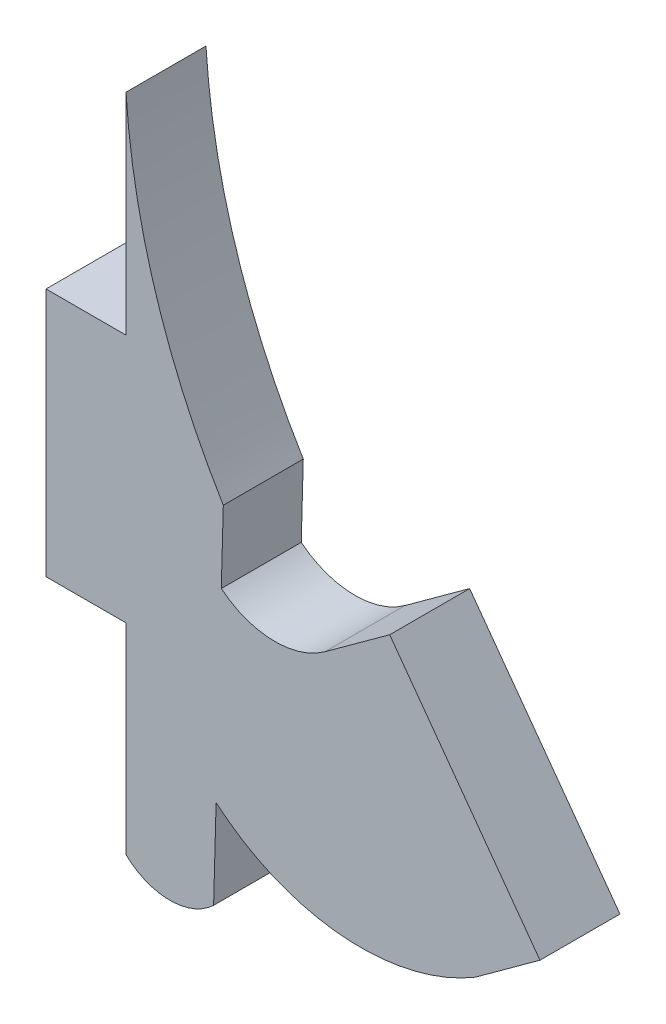
ISO-10303-21;
HEADER;
FILE_DESCRIPTION(('STEP AP214'),'2;1');
FILE_NAME('part.step','',(''),(''),'','','');
FILE_SCHEMA(('AUTOMOTIVE_DESIGN { 1 0 10303 214 1 1 1 1 }'));
ENDSEC;
DATA;
#1=APPLICATION_CONTEXT('core data for automotive mechanical design processes');
#2=APPLICATION_PROTOCOL_DEFINITION('international standard','automotive_design',2000,#1);
#3=PRODUCT_CONTEXT('',#1,'mechanical');
#4=PRODUCT('Part','Part','',(#3));
#5=PRODUCT_RELATED_PRODUCT_CATEGORY('part','',(#4));
#6=PRODUCT_DEFINITION_FORMATION('','',#4);
#7=PRODUCT_DEFINITION_CONTEXT('part definition',#1,'design');
#8=PRODUCT_DEFINITION('design','',#6,#7);
#9=PRODUCT_DEFINITION_SHAPE('','',#8);
#10=(LENGTH_UNIT() NAMED_UNIT(*) SI_UNIT(.MILLI.,.METRE.));
#11=(NAMED_UNIT(*) PLANE_ANGLE_UNIT() SI_UNIT($,.RADIAN.));
#12=(NAMED_UNIT(*) SI_UNIT($,.STERADIAN.) SOLID_ANGLE_UNIT());
#13=UNCERTAINTY_MEASURE_WITH_UNIT(LENGTH_MEASURE(1.E-05),#10,'distance_accuracy_value','');
#14=(GEOMETRIC_REPRESENTATION_CONTEXT(3) GLOBAL_UNCERTAINTY_ASSIGNED_CONTEXT((#13)) GLOBAL_UNIT_ASSIGNED_CONTEXT((#10,
#11,#12)) REPRESENTATION_CONTEXT('',''));
#15=CARTESIAN_POINT('',(0.,0.,0.));
#16=DIRECTION('',(0.,0.,1.));
#17=DIRECTION('',(1.,0.,0.));
#18=AXIS2_PLACEMENT_3D('',#15,#16,#17);
#19=CARTESIAN_POINT('',(1.524,26.9676802822344,1.524));
#20=DIRECTION('',(1.,0.,0.));
#21=DIRECTION('',(0.,0.,-1.));
#22=AXIS2_PLACEMENT_3D('',#19,#20,#21);
#23=PLANE('',#22);
#24=DIRECTION('',(0.,-1.,0.));
#25=VECTOR('',#24,1.);
#26=CARTESIAN_POINT('',(1.524,26.9676802822344,0.));
#27=LINE('',#26,#25);
#28=CARTESIAN_POINT('',(1.524,30.9773636520418,0.));
#29=VERTEX_POINT('',#28);
#30=CARTESIAN_POINT('',(1.524,26.9676802822344,0.));
#31=VERTEX_POINT('',#30);
#32=EDGE_CURVE('E163',#29,#31,#27,.T.);
#33=ORIENTED_EDGE('',*,*,#32,.T.);
#34=DIRECTION('',(0.,0.,-1.));
#35=VECTOR('',#34,1.);
#36=CARTESIAN_POINT('',(1.524,26.9676802822344,1.524));
#37=LINE('',#36,#35);
#38=CARTESIAN_POINT('',(1.524,26.9676802822344,1.524));
#39=VERTEX_POINT('',#38);
#40=EDGE_CURVE('E11',#39,#31,#37,.T.);
#41=ORIENTED_EDGE('',*,*,#40,.F.);
#42=DIRECTION('',(0.,-1.,0.));
#43=VECTOR('',#42,1.);
#44=CARTESIAN_POINT('',(1.524,26.9676802822344,1.524));
#45=LINE('',#44,#43);
#46=CARTESIAN_POINT('',(1.524,30.9773636520418,1.524));
#47=VERTEX_POINT('',#46);
#48=EDGE_CURVE('E189',#47,#39,#45,.T.);
#49=ORIENTED_EDGE('',*,*,#48,.F.);
#50=DIRECTION('',(0.,0.,-1.));
#51=VECTOR('',#50,1.);
#52=CARTESIAN_POINT('',(1.524,30.9773636520418,1.524));
#53=LINE('',#52,#51);
#54=EDGE_CURVE('E159',#47,#29,#53,.T.);
#55=ORIENTED_EDGE('',*,*,#54,.T.);
#56=EDGE_LOOP('',(#33,#41,#49,#55));
#57=FACE_BOUND('',#56,.T.);
#58=ADVANCED_FACE('F31',(#57),#23,.F.);
#59=CARTESIAN_POINT('',(1.524,26.9676802822344,1.524));
#60=DIRECTION('',(0.,-1.,0.));
#61=DIRECTION('',(0.,0.,-1.));
#62=AXIS2_PLACEMENT_3D('',#59,#60,#61);
#63=PLANE('',#62);
#64=DIRECTION('',(-1.,0.,0.));
#65=VECTOR('',#64,1.);
#66=CARTESIAN_POINT('',(1.524,26.9676802822344,0.));
#67=LINE('',#66,#65);
#68=CARTESIAN_POINT('',(0.,26.9676802822344,0.));
#69=VERTEX_POINT('',#68);
#70=EDGE_CURVE('E166',#31,#69,#67,.T.);
#71=ORIENTED_EDGE('',*,*,#70,.T.);
#72=DIRECTION('',(0.,0.,-1.));
#73=VECTOR('',#72,1.);
#74=CARTESIAN_POINT('',(0.,26.9676802822344,1.524));
#75=LINE('',#74,#73);
#76=CARTESIAN_POINT('',(0.,26.9676802822344,1.524));
#77=VERTEX_POINT('',#76);
#78=EDGE_CURVE('E39',#77,#69,#75,.T.);
#79=ORIENTED_EDGE('',*,*,#78,.F.);
#80=DIRECTION('',(-1.,0.,0.));
#81=VECTOR('',#80,1.);
#82=CARTESIAN_POINT('',(1.524,26.9676802822344,1.524));
#83=LINE('',#82,#81);
#84=EDGE_CURVE('E108',#39,#77,#83,.T.);
#85=ORIENTED_EDGE('',*,*,#84,.F.);
#86=ORIENTED_EDGE('',*,*,#40,.T.);
#87=EDGE_LOOP('',(#71,#79,#85,#86));
#88=FACE_BOUND('',#87,.T.);
#89=ADVANCED_FACE('F277',(#88),#63,.F.);
#90=CARTESIAN_POINT('',(0.,26.9676802822344,1.524));
#91=DIRECTION('',(1.,0.,0.));
#92=DIRECTION('',(0.,1.,0.));
#93=AXIS2_PLACEMENT_3D('',#90,#91,#92);
#94=PLANE('',#93);
#95=DIRECTION('',(0.,-1.,0.));
#96=VECTOR('',#95,1.);
#97=CARTESIAN_POINT('',(0.,26.9676802822344,0.));
#98=LINE('',#97,#96);
#99=CARTESIAN_POINT('',(0.,22.2178802822344,0.));
#100=VERTEX_POINT('',#99);
#101=EDGE_CURVE('E168',#69,#100,#98,.T.);
#102=ORIENTED_EDGE('',*,*,#101,.T.);
#103=DIRECTION('',(0.,0.,-1.));
#104=VECTOR('',#103,1.);
#105=CARTESIAN_POINT('',(0.,22.2178802822344,1.524));
#106=LINE('',#105,#104);
#107=CARTESIAN_POINT('',(0.,22.2178802822344,1.524));
#108=VERTEX_POINT('',#107);
#109=EDGE_CURVE('E214',#108,#100,#106,.T.);
#110=ORIENTED_EDGE('',*,*,#109,.F.);
#111=DIRECTION('',(0.,-1.,0.));
#112=VECTOR('',#111,1.);
#113=CARTESIAN_POINT('',(0.,26.9676802822344,1.524));
#114=LINE('',#113,#112);
#115=EDGE_CURVE('E222',#77,#108,#114,.T.);
#116=ORIENTED_EDGE('',*,*,#115,.F.);
#117=ORIENTED_EDGE('',*,*,#78,.T.);
#118=EDGE_LOOP('',(#102,#110,#116,#117));
#119=FACE_BOUND('',#118,.T.);
#120=ADVANCED_FACE('F220',(#119),#94,.F.);
#121=CARTESIAN_POINT('',(0.,22.2178802822344,1.524));
#122=DIRECTION('',(0.,1.,0.));
#123=DIRECTION('',(0.,0.,1.));
#124=AXIS2_PLACEMENT_3D('',#121,#122,#123);
#125=PLANE('',#124);
#126=DIRECTION('',(1.,0.,0.));
#127=VECTOR('',#126,1.);
#128=CARTESIAN_POINT('',(0.,22.2178802822344,0.));
#129=LINE('',#128,#127);
#130=CARTESIAN_POINT('',(1.524,22.2178802822344,0.));
#131=VERTEX_POINT('',#130);
#132=EDGE_CURVE('E170',#100,#131,#129,.T.);
#133=ORIENTED_EDGE('',*,*,#132,.T.);
#134=DIRECTION('',(0.,0.,-1.));
#135=VECTOR('',#134,1.);
#136=CARTESIAN_POINT('',(1.524,22.2178802822344,1.524));
#137=LINE('',#136,#135);
#138=CARTESIAN_POINT('',(1.524,22.2178802822344,1.524));
#139=VERTEX_POINT('',#138);
#140=EDGE_CURVE('E211',#139,#131,#137,.T.);
#141=ORIENTED_EDGE('',*,*,#140,.F.);
#142=DIRECTION('',(1.,0.,0.));
#143=VECTOR('',#142,1.);
#144=CARTESIAN_POINT('',(0.,22.2178802822344,1.524));
#145=LINE('',#144,#143);
#146=EDGE_CURVE('E240',#108,#139,#145,.T.);
#147=ORIENTED_EDGE('',*,*,#146,.F.);
#148=ORIENTED_EDGE('',*,*,#109,.T.);
#149=EDGE_LOOP('',(#133,#141,#147,#148));
#150=FACE_BOUND('',#149,.T.);
#151=ADVANCED_FACE('F231',(#150),#125,.F.);
#152=CARTESIAN_POINT('',(1.524,22.2178802822344,1.524));
#153=DIRECTION('',(1.,0.,0.));
#154=DIRECTION('',(0.,0.,-1.));
#155=AXIS2_PLACEMENT_3D('',#152,#153,#154);
#156=PLANE('',#155);
#157=DIRECTION('',(0.,-1.,0.));
#158=VECTOR('',#157,1.);
#159=CARTESIAN_POINT('',(1.524,22.2178802822344,0.));
#160=LINE('',#159,#158);
#161=CARTESIAN_POINT('',(1.524,18.3912713392971,0.));
#162=VERTEX_POINT('',#161);
#163=EDGE_CURVE('E172',#131,#162,#160,.T.);
#164=ORIENTED_EDGE('',*,*,#163,.T.);
#165=DIRECTION('',(0.,0.,-1.));
#166=VECTOR('',#165,1.);
#167=CARTESIAN_POINT('',(1.524,18.3912713392971,1.524));
#168=LINE('',#167,#166);
#169=CARTESIAN_POINT('',(1.524,18.3912713392971,1.524));
#170=VERTEX_POINT('',#169);
#171=EDGE_CURVE('E208',#170,#162,#168,.T.);
#172=ORIENTED_EDGE('',*,*,#171,.F.);
#173=DIRECTION('',(0.,-1.,0.));
#174=VECTOR('',#173,1.);
#175=CARTESIAN_POINT('',(1.524,22.2178802822344,1.524));
#176=LINE('',#175,#174);
#177=EDGE_CURVE('E237',#139,#170,#176,.T.);
#178=ORIENTED_EDGE('',*,*,#177,.F.);
#179=ORIENTED_EDGE('',*,*,#140,.T.);
#180=EDGE_LOOP('',(#164,#172,#178,#179));
#181=FACE_BOUND('',#180,.T.);
#182=ADVANCED_FACE('F235',(#181),#156,.F.);
#183=CARTESIAN_POINT('',(2.35885273270327,19.2678550541222,1.524));
#184=DIRECTION('',(0.,0.,-1.));
#185=DIRECTION('',(-1.,0.,0.));
#186=AXIS2_PLACEMENT_3D('',#183,#184,#185);
#187=CYLINDRICAL_SURFACE('',#186,1.21052802297128);
#188=CARTESIAN_POINT('',(2.35885273270327,19.2678550541222,0.));
#189=DIRECTION('',(0.,0.,1.));
#190=DIRECTION('',(1.,0.,0.));
#191=AXIS2_PLACEMENT_3D('',#188,#189,#190);
#192=CIRCLE('',#191,1.21052802297128);
#193=CARTESIAN_POINT('',(3.19370546540654,18.3912713392971,0.));
#194=VERTEX_POINT('',#193);
#195=EDGE_CURVE('E174',#162,#194,#192,.T.);
#196=ORIENTED_EDGE('',*,*,#195,.T.);
#197=DIRECTION('',(0.,0.,-1.));
#198=VECTOR('',#197,1.);
#199=CARTESIAN_POINT('',(3.19370546540654,18.3912713392971,1.524));
#200=LINE('',#199,#198);
#201=CARTESIAN_POINT('',(3.19370546540654,18.3912713392971,1.524));
#202=VERTEX_POINT('',#201);
#203=EDGE_CURVE('E205',#202,#194,#200,.T.);
#204=ORIENTED_EDGE('',*,*,#203,.F.);
#205=CARTESIAN_POINT('',(2.35885273270327,19.2678550541222,1.524));
#206=DIRECTION('',(0.,0.,1.));
#207=DIRECTION('',(1.,0.,0.));
#208=AXIS2_PLACEMENT_3D('',#205,#206,#207);
#209=CIRCLE('',#208,1.21052802297128);
#210=EDGE_CURVE('E239',#170,#202,#209,.T.);
#211=ORIENTED_EDGE('',*,*,#210,.F.);
#212=ORIENTED_EDGE('',*,*,#171,.T.);
#213=EDGE_LOOP('',(#196,#204,#211,#212));
#214=FACE_BOUND('',#213,.T.);
#215=ADVANCED_FACE('F290',(#214),#187,.T.);
#216=CARTESIAN_POINT('',(3.19370546540654,18.3912713392971,1.524));
#217=DIRECTION('',(-0.999619974008747,0.0275664209275025,0.));
#218=DIRECTION('',(-0.0275664209275025,-0.999619974008747,0.));
#219=AXIS2_PLACEMENT_3D('',#216,#217,#218);
#220=PLANE('',#219);
#221=DIRECTION('',(0.0275664209275025,0.999619974008747,0.));
#222=VECTOR('',#221,1.);
#223=CARTESIAN_POINT('',(3.19370546540654,18.3912713392971,0.));
#224=LINE('',#223,#222);
#225=CARTESIAN_POINT('',(3.24110572135515,20.1101104567863,0.));
#226=VERTEX_POINT('',#225);
#227=EDGE_CURVE('E176',#194,#226,#224,.T.);
#228=ORIENTED_EDGE('',*,*,#227,.T.);
#229=DIRECTION('',(0.,0.,-1.));
#230=VECTOR('',#229,1.);
#231=CARTESIAN_POINT('',(3.24110572135515,20.1101104567863,1.524));
#232=LINE('',#231,#230);
#233=CARTESIAN_POINT('',(3.24110572135515,20.1101104567863,1.524));
#234=VERTEX_POINT('',#233);
#235=EDGE_CURVE('E202',#234,#226,#232,.T.);
#236=ORIENTED_EDGE('',*,*,#235,.F.);
#237=DIRECTION('',(0.0275664209275025,0.999619974008747,0.));
#238=VECTOR('',#237,1.);
#239=CARTESIAN_POINT('',(3.19370546540654,18.3912713392971,1.524));
#240=LINE('',#239,#238);
#241=EDGE_CURVE('E242',#202,#234,#240,.T.);
#242=ORIENTED_EDGE('',*,*,#241,.F.);
#243=ORIENTED_EDGE('',*,*,#203,.T.);
#244=EDGE_LOOP('',(#228,#236,#242,#243));
#245=FACE_BOUND('',#244,.T.);
#246=ADVANCED_FACE('F293',(#245),#220,.F.);
#247=CARTESIAN_POINT('',(5.99816949100195,23.3530518170178,1.524));
#248=DIRECTION('',(0.,0.,-1.));
#249=DIRECTION('',(-1.,0.,0.));
#250=AXIS2_PLACEMENT_3D('',#247,#248,#249);
#251=CYLINDRICAL_SURFACE('',#250,4.25653254372605);
#252=CARTESIAN_POINT('',(5.99816949100195,23.3530518170178,0.));
#253=DIRECTION('',(0.,0.,1.));
#254=DIRECTION('',(1.,0.,0.));
#255=AXIS2_PLACEMENT_3D('',#252,#253,#254);
#256=CIRCLE('',#255,4.25653254372605);
#257=CARTESIAN_POINT('',(8.18148207060549,19.6991203075962,0.));
#258=VERTEX_POINT('',#257);
#259=EDGE_CURVE('E178',#226,#258,#256,.T.);
#260=ORIENTED_EDGE('',*,*,#259,.T.);
#261=DIRECTION('',(0.,0.,-1.));
#262=VECTOR('',#261,1.);
#263=CARTESIAN_POINT('',(8.18148207060549,19.6991203075962,1.524));
#264=LINE('',#263,#262);
#265=CARTESIAN_POINT('',(8.18148207060549,19.6991203075962,1.524));
#266=VERTEX_POINT('',#265);
#267=EDGE_CURVE('E199',#266,#258,#264,.T.);
#268=ORIENTED_EDGE('',*,*,#267,.F.);
#269=CARTESIAN_POINT('',(5.99816949100195,23.3530518170178,1.524));
#270=DIRECTION('',(0.,0.,1.));
#271=DIRECTION('',(1.,0.,0.));
#272=AXIS2_PLACEMENT_3D('',#269,#270,#271);
#273=CIRCLE('',#272,4.25653254372605);
#274=EDGE_CURVE('E248',#234,#266,#273,.T.);
#275=ORIENTED_EDGE('',*,*,#274,.F.);
#276=ORIENTED_EDGE('',*,*,#235,.T.);
#277=EDGE_LOOP('',(#260,#268,#275,#276));
#278=FACE_BOUND('',#277,.T.);
#279=ADVANCED_FACE('F297',(#278),#251,.T.);
#280=CARTESIAN_POINT('',(8.18148207060549,19.6991203075962,1.524));
#281=DIRECTION('',(-0.588155609867833,0.808747784281971,0.));
#282=DIRECTION('',(-0.808747784281971,-0.588155609867833,0.));
#283=AXIS2_PLACEMENT_3D('',#280,#281,#282);
#284=PLANE('',#283);
#285=DIRECTION('',(0.808747784281971,0.588155609867833,0.));
#286=VECTOR('',#285,1.);
#287=CARTESIAN_POINT('',(8.18148207060549,19.6991203075962,0.));
#288=LINE('',#287,#286);
#289=CARTESIAN_POINT('',(9.41401369385122,20.5954694570348,0.));
#290=VERTEX_POINT('',#289);
#291=EDGE_CURVE('E180',#258,#290,#288,.T.);
#292=ORIENTED_EDGE('',*,*,#291,.T.);
#293=DIRECTION('',(0.,0.,-1.));
#294=VECTOR('',#293,1.);
#295=CARTESIAN_POINT('',(9.41401369385122,20.5954694570348,1.524));
#296=LINE('',#295,#294);
#297=CARTESIAN_POINT('',(9.41401369385122,20.5954694570348,1.524));
#298=VERTEX_POINT('',#297);
#299=EDGE_CURVE('E196',#298,#290,#296,.T.);
#300=ORIENTED_EDGE('',*,*,#299,.F.);
#301=DIRECTION('',(0.808747784281971,0.588155609867833,0.));
#302=VECTOR('',#301,1.);
#303=CARTESIAN_POINT('',(8.18148207060549,19.6991203075962,1.524));
#304=LINE('',#303,#302);
#305=EDGE_CURVE('E250',#266,#298,#304,.T.);
#306=ORIENTED_EDGE('',*,*,#305,.F.);
#307=ORIENTED_EDGE('',*,*,#267,.T.);
#308=EDGE_LOOP('',(#292,#300,#306,#307));
#309=FACE_BOUND('',#308,.T.);
#310=ADVANCED_FACE('F301',(#309),#284,.F.);
#311=CARTESIAN_POINT('',(6.54906827988797,24.5349341441985,1.524));
#312=DIRECTION('',(-0.80874778428197,-0.588155609867834,0.));
#313=DIRECTION('',(0.588155609867834,-0.80874778428197,0.));
#314=AXIS2_PLACEMENT_3D('',#311,#312,#313);
#315=PLANE('',#314);
#316=DIRECTION('',(-0.588155609867834,0.80874778428197,0.));
#317=VECTOR('',#316,1.);
#318=CARTESIAN_POINT('',(6.54906827988797,24.5349341441985,0.));
#319=LINE('',#318,#317);
#320=CARTESIAN_POINT('',(6.54906827988797,24.5349341441985,0.));
#321=VERTEX_POINT('',#320);
#322=EDGE_CURVE('E182',#290,#321,#319,.T.);
#323=ORIENTED_EDGE('',*,*,#322,.T.);
#324=DIRECTION('',(0.,0.,-1.));
#325=VECTOR('',#324,1.);
#326=CARTESIAN_POINT('',(6.54906827988797,24.5349341441985,1.524));
#327=LINE('',#326,#325);
#328=CARTESIAN_POINT('',(6.54906827988797,24.5349341441985,1.524));
#329=VERTEX_POINT('',#328);
#330=EDGE_CURVE('E193',#329,#321,#327,.T.);
#331=ORIENTED_EDGE('',*,*,#330,.F.);
#332=DIRECTION('',(-0.588155609867834,0.80874778428197,0.));
#333=VECTOR('',#332,1.);
#334=CARTESIAN_POINT('',(6.54906827988797,24.5349341441985,1.524));
#335=LINE('',#334,#333);
#336=EDGE_CURVE('E252',#298,#329,#335,.T.);
#337=ORIENTED_EDGE('',*,*,#336,.F.);
#338=ORIENTED_EDGE('',*,*,#299,.T.);
#339=EDGE_LOOP('',(#323,#331,#337,#338));
#340=FACE_BOUND('',#339,.T.);
#341=ADVANCED_FACE('F258',(#340),#315,.F.);
#342=CARTESIAN_POINT('',(5.31653665664225,23.6385849947599,1.524));
#343=DIRECTION('',(0.588155609867833,-0.808747784281971,0.));
#344=DIRECTION('',(0.808747784281971,0.588155609867833,0.));
#345=AXIS2_PLACEMENT_3D('',#342,#343,#344);
#346=PLANE('',#345);
#347=DIRECTION('',(-0.808747784281971,-0.588155609867833,0.));
#348=VECTOR('',#347,1.);
#349=CARTESIAN_POINT('',(5.31653665664225,23.6385849947599,0.));
#350=LINE('',#349,#348);
#351=CARTESIAN_POINT('',(5.31653665664225,23.6385849947599,0.));
#352=VERTEX_POINT('',#351);
#353=EDGE_CURVE('E184',#321,#352,#350,.T.);
#354=ORIENTED_EDGE('',*,*,#353,.T.);
#355=DIRECTION('',(0.,0.,-1.));
#356=VECTOR('',#355,1.);
#357=CARTESIAN_POINT('',(5.31653665664225,23.6385849947599,1.524));
#358=LINE('',#357,#356);
#359=CARTESIAN_POINT('',(5.31653665664225,23.6385849947599,1.524));
#360=VERTEX_POINT('',#359);
#361=EDGE_CURVE('E154',#360,#352,#358,.T.);
#362=ORIENTED_EDGE('',*,*,#361,.F.);
#363=DIRECTION('',(-0.808747784281971,-0.588155609867833,0.));
#364=VECTOR('',#363,1.);
#365=CARTESIAN_POINT('',(5.31653665664225,23.6385849947599,1.524));
#366=LINE('',#365,#364);
#367=EDGE_CURVE('E145',#329,#360,#366,.T.);
#368=ORIENTED_EDGE('',*,*,#367,.F.);
#369=ORIENTED_EDGE('',*,*,#330,.T.);
#370=EDGE_LOOP('',(#354,#362,#368,#369));
#371=FACE_BOUND('',#370,.T.);
#372=ADVANCED_FACE('F262',(#371),#346,.F.);
#373=CARTESIAN_POINT('',(4.36360826267953,24.9489163327028,1.524));
#374=DIRECTION('',(0.,0.,-1.));
#375=DIRECTION('',(-1.,0.,0.));
#376=AXIS2_PLACEMENT_3D('',#373,#374,#375);
#377=CYLINDRICAL_SURFACE('',#376,1.62019774694805);
#378=CARTESIAN_POINT('',(4.36360826267953,24.9489163327028,0.));
#379=DIRECTION('',(0.,0.,-1.));
#380=DIRECTION('',(1.,0.,0.));
#381=AXIS2_PLACEMENT_3D('',#378,#379,#380);
#382=CIRCLE('',#381,1.62019774694805);
#383=CARTESIAN_POINT('',(3.33991330721905,23.6930941409175,0.));
#384=VERTEX_POINT('',#383);
#385=EDGE_CURVE('E153',#352,#384,#382,.T.);
#386=ORIENTED_EDGE('',*,*,#385,.T.);
#387=DIRECTION('',(0.,0.,-1.));
#388=VECTOR('',#387,1.);
#389=CARTESIAN_POINT('',(3.33991330721905,23.6930941409175,1.524));
#390=LINE('',#389,#388);
#391=CARTESIAN_POINT('',(3.33991330721905,23.6930941409175,1.524));
#392=VERTEX_POINT('',#391);
#393=EDGE_CURVE('E150',#392,#384,#390,.T.);
#394=ORIENTED_EDGE('',*,*,#393,.F.);
#395=CARTESIAN_POINT('',(4.36360826267953,24.9489163327028,1.524));
#396=DIRECTION('',(0.,0.,-1.));
#397=DIRECTION('',(1.,0.,0.));
#398=AXIS2_PLACEMENT_3D('',#395,#396,#397);
#399=CIRCLE('',#398,1.62019774694805);
#400=EDGE_CURVE('E139',#360,#392,#399,.T.);
#401=ORIENTED_EDGE('',*,*,#400,.F.);
#402=ORIENTED_EDGE('',*,*,#361,.T.);
#403=EDGE_LOOP('',(#386,#394,#401,#402));
#404=FACE_BOUND('',#403,.T.);
#405=ADVANCED_FACE('F151',(#404),#377,.F.);
#406=CARTESIAN_POINT('',(3.33991330721905,23.6930941409175,1.524));
#407=DIRECTION('',(-0.999619974008747,0.0275664209275025,0.));
#408=DIRECTION('',(-0.0275664209275025,-0.999619974008747,0.));
#409=AXIS2_PLACEMENT_3D('',#406,#407,#408);
#410=PLANE('',#409);
#411=DIRECTION('',(0.0275664209275025,0.999619974008747,0.));
#412=VECTOR('',#411,1.);
#413=CARTESIAN_POINT('',(3.33991330721905,23.6930941409175,0.));
#414=LINE('',#413,#412);
#415=CARTESIAN_POINT('',(3.37836534787783,25.0874509921388,0.));
#416=VERTEX_POINT('',#415);
#417=EDGE_CURVE('E94',#384,#416,#414,.T.);
#418=ORIENTED_EDGE('',*,*,#417,.T.);
#419=DIRECTION('',(0.,0.,-1.));
#420=VECTOR('',#419,1.);
#421=CARTESIAN_POINT('',(3.37836534787783,25.0874509921388,1.524));
#422=LINE('',#421,#420);
#423=CARTESIAN_POINT('',(3.37836534787783,25.0874509921388,1.524));
#424=VERTEX_POINT('',#423);
#425=EDGE_CURVE('E155',#424,#416,#422,.T.);
#426=ORIENTED_EDGE('',*,*,#425,.F.);
#427=DIRECTION('',(0.0275664209275025,0.999619974008747,0.));
#428=VECTOR('',#427,1.);
#429=CARTESIAN_POINT('',(3.33991330721905,23.6930941409175,1.524));
#430=LINE('',#429,#428);
#431=EDGE_CURVE('E143',#392,#424,#430,.T.);
#432=ORIENTED_EDGE('',*,*,#431,.F.);
#433=ORIENTED_EDGE('',*,*,#393,.T.);
#434=EDGE_LOOP('',(#418,#426,#432,#433));
#435=FACE_BOUND('',#434,.T.);
#436=ADVANCED_FACE('F157',(#435),#410,.F.);
#437=CARTESIAN_POINT('',(14.474101182375,31.8176728684168,1.524));
#438=DIRECTION('',(0.,0.,-1.));
#439=DIRECTION('',(-1.,0.,0.));
#440=AXIS2_PLACEMENT_3D('',#437,#438,#439);
#441=CYLINDRICAL_SURFACE('',#440,12.9773356361341);
#442=CARTESIAN_POINT('',(14.474101182375,31.8176728684168,0.));
#443=DIRECTION('',(0.,0.,-1.));
#444=DIRECTION('',(1.,0.,0.));
#445=AXIS2_PLACEMENT_3D('',#442,#443,#444);
#446=CIRCLE('',#445,12.9773356361341);
#447=EDGE_CURVE('E100',#416,#29,#446,.T.);
#448=ORIENTED_EDGE('',*,*,#447,.T.);
#449=ORIENTED_EDGE('',*,*,#54,.F.);
#450=CARTESIAN_POINT('',(14.474101182375,31.8176728684168,1.524));
#451=DIRECTION('',(0.,0.,-1.));
#452=DIRECTION('',(1.,0.,0.));
#453=AXIS2_PLACEMENT_3D('',#450,#451,#452);
#454=CIRCLE('',#453,12.9773356361341);
#455=EDGE_CURVE('E47',#424,#47,#454,.T.);
#456=ORIENTED_EDGE('',*,*,#455,.F.);
#457=ORIENTED_EDGE('',*,*,#425,.T.);
#458=EDGE_LOOP('',(#448,#449,#456,#457));
#459=FACE_BOUND('',#458,.T.);
#460=ADVANCED_FACE('F266',(#459),#441,.F.);
#461=CARTESIAN_POINT('',(14.474101182375,31.8176728684168,1.524));
#462=DIRECTION('',(0.,0.,1.));
#463=DIRECTION('',(1.,0.,0.));
#464=AXIS2_PLACEMENT_3D('',#461,#462,#463);
#465=PLANE('',#464);
#466=ORIENTED_EDGE('',*,*,#48,.T.);
#467=ORIENTED_EDGE('',*,*,#84,.T.);
#468=ORIENTED_EDGE('',*,*,#115,.T.);
#469=ORIENTED_EDGE('',*,*,#146,.T.);
#470=ORIENTED_EDGE('',*,*,#177,.T.);
#471=ORIENTED_EDGE('',*,*,#210,.T.);
#472=ORIENTED_EDGE('',*,*,#241,.T.);
#473=ORIENTED_EDGE('',*,*,#274,.T.);
#474=ORIENTED_EDGE('',*,*,#305,.T.);
#475=ORIENTED_EDGE('',*,*,#336,.T.);
#476=ORIENTED_EDGE('',*,*,#367,.T.);
#477=ORIENTED_EDGE('',*,*,#400,.T.);
#478=ORIENTED_EDGE('',*,*,#431,.T.);
#479=ORIENTED_EDGE('',*,*,#455,.T.);
#480=EDGE_LOOP('',(#466,#467,#468,#469,#470,#471,#472,#473,#474,#475,#476,#477,#478,#479));
#481=FACE_BOUND('',#480,.T.);
#482=ADVANCED_FACE('F141',(#481),#465,.T.);
#483=CARTESIAN_POINT('',(14.474101182375,31.8176728684168,0.));
#484=DIRECTION('',(0.,0.,1.));
#485=DIRECTION('',(1.,0.,0.));
#486=AXIS2_PLACEMENT_3D('',#483,#484,#485);
#487=PLANE('',#486);
#488=ORIENTED_EDGE('',*,*,#32,.F.);
#489=ORIENTED_EDGE('',*,*,#447,.F.);
#490=ORIENTED_EDGE('',*,*,#417,.F.);
#491=ORIENTED_EDGE('',*,*,#385,.F.);
#492=ORIENTED_EDGE('',*,*,#353,.F.);
#493=ORIENTED_EDGE('',*,*,#322,.F.);
#494=ORIENTED_EDGE('',*,*,#291,.F.);
#495=ORIENTED_EDGE('',*,*,#259,.F.);
#496=ORIENTED_EDGE('',*,*,#227,.F.);
#497=ORIENTED_EDGE('',*,*,#195,.F.);
#498=ORIENTED_EDGE('',*,*,#163,.F.);
#499=ORIENTED_EDGE('',*,*,#132,.F.);
#500=ORIENTED_EDGE('',*,*,#101,.F.);
#501=ORIENTED_EDGE('',*,*,#70,.F.);
#502=EDGE_LOOP('',(#488,#489,#490,#491,#492,#493,#494,#495,#496,#497,#498,#499,#500,#501));
#503=FACE_BOUND('',#502,.T.);
#504=ADVANCED_FACE('F226',(#503),#487,.F.);
#505=CLOSED_SHELL('',(#58,#89,#120,#151,#182,#215,#246,#279,#310,#341,#372,#405,#436,#460,#482,#504));
#506=MANIFOLD_SOLID_BREP('B2',#505);
#507=ADVANCED_BREP_SHAPE_REPRESENTATION('',(#18,#506),#14);
#508=SHAPE_DEFINITION_REPRESENTATION(#9,#507);
ENDSEC;
END-ISO-10303-21;
